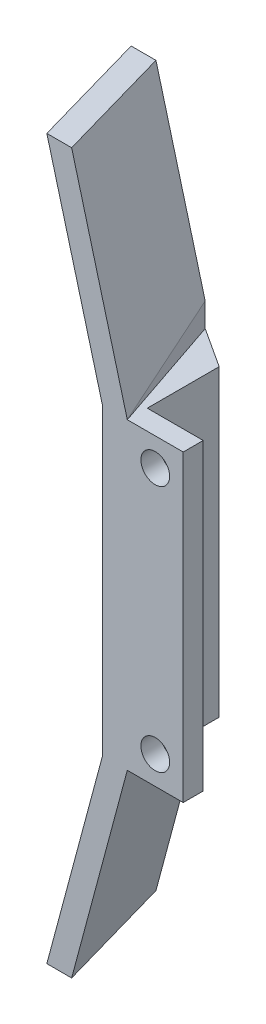
ISO-10303-21;
HEADER;
FILE_DESCRIPTION(('STEP AP214'),'2;1');
FILE_NAME('part.step','',(''),(''),'','','');
FILE_SCHEMA(('AUTOMOTIVE_DESIGN { 1 0 10303 214 1 1 1 1 }'));
ENDSEC;
DATA;
#1=APPLICATION_CONTEXT('core data for automotive mechanical design processes');
#2=APPLICATION_PROTOCOL_DEFINITION('international standard','automotive_design',2000,#1);
#3=PRODUCT_CONTEXT('',#1,'mechanical');
#4=PRODUCT('Part','Part','',(#3));
#5=PRODUCT_RELATED_PRODUCT_CATEGORY('part','',(#4));
#6=PRODUCT_DEFINITION_FORMATION('','',#4);
#7=PRODUCT_DEFINITION_CONTEXT('part definition',#1,'design');
#8=PRODUCT_DEFINITION('design','',#6,#7);
#9=PRODUCT_DEFINITION_SHAPE('','',#8);
#10=(LENGTH_UNIT() NAMED_UNIT(*) SI_UNIT(.MILLI.,.METRE.));
#11=(NAMED_UNIT(*) PLANE_ANGLE_UNIT() SI_UNIT($,.RADIAN.));
#12=(NAMED_UNIT(*) SI_UNIT($,.STERADIAN.) SOLID_ANGLE_UNIT());
#13=UNCERTAINTY_MEASURE_WITH_UNIT(LENGTH_MEASURE(1.E-05),#10,'distance_accuracy_value','');
#14=(GEOMETRIC_REPRESENTATION_CONTEXT(3) GLOBAL_UNCERTAINTY_ASSIGNED_CONTEXT((#13)) GLOBAL_UNIT_ASSIGNED_CONTEXT((#10,
#11,#12)) REPRESENTATION_CONTEXT('',''));
#15=CARTESIAN_POINT('',(0.,0.,0.));
#16=DIRECTION('',(0.,0.,1.));
#17=DIRECTION('',(1.,0.,0.));
#18=AXIS2_PLACEMENT_3D('',#15,#16,#17);
#19=CARTESIAN_POINT('',(0.,0.,0.));
#20=DIRECTION('',(0.947065879415799,0.,-0.321039281157898));
#21=DIRECTION('',(-0.321039281157898,0.,-0.947065879415799));
#22=AXIS2_PLACEMENT_3D('',#19,#20,#21);
#23=PLANE('',#22);
#24=DIRECTION('',(0.,1.,0.));
#25=VECTOR('',#24,1.);
#26=CARTESIAN_POINT('',(-5.,22.,-14.75));
#27=LINE('',#26,#25);
#28=CARTESIAN_POINT('',(-4.99999999999999,-22.,-14.75));
#29=VERTEX_POINT('',#28);
#30=CARTESIAN_POINT('',(-4.99999999999999,-19.,-14.75));
#31=VERTEX_POINT('',#30);
#32=EDGE_CURVE('E525',#29,#31,#27,.T.);
#33=ORIENTED_EDGE('',*,*,#32,.T.);
#34=DIRECTION('',(0.321039281157898,0.,0.947065879415799));
#35=VECTOR('',#34,1.);
#36=CARTESIAN_POINT('',(-51533.8701365627,-19.0000000000061,-152024.91690286));
#37=LINE('',#36,#35);
#38=CARTESIAN_POINT('',(-2.0122792321331E-13,-19.,0.));
#39=VERTEX_POINT('',#38);
#40=EDGE_CURVE('E77',#31,#39,#37,.T.);
#41=ORIENTED_EDGE('',*,*,#40,.T.);
#42=DIRECTION('',(-0.31524416249564,-0.189146497497384,-0.929970279362139));
#43=VECTOR('',#42,1.);
#44=CARTESIAN_POINT('',(0.,-19.,0.));
#45=LINE('',#44,#43);
#46=EDGE_CURVE('E498',#39,#29,#45,.T.);
#47=ORIENTED_EDGE('',*,*,#46,.T.);
#48=EDGE_LOOP('',(#33,#41,#47));
#49=FACE_BOUND('',#48,.T.);
#50=ADVANCED_FACE('F51',(#49),#23,.T.);
#51=CARTESIAN_POINT('',(0.,0.,-2.5));
#52=DIRECTION('',(0.,0.,1.));
#53=DIRECTION('',(1.,0.,0.));
#54=AXIS2_PLACEMENT_3D('',#51,#52,#53);
#55=PLANE('',#54);
#56=CARTESIAN_POINT('',(3.5,15.5,-2.5));
#57=DIRECTION('',(0.,0.,1.));
#58=DIRECTION('',(1.,0.,0.));
#59=AXIS2_PLACEMENT_3D('',#56,#57,#58);
#60=CIRCLE('',#59,1.8);
#61=CARTESIAN_POINT('',(5.3,15.5,-2.5));
#62=VERTEX_POINT('',#61);
#63=EDGE_CURVE('E195',#62,#62,#60,.F.);
#64=ORIENTED_EDGE('',*,*,#63,.F.);
#65=EDGE_LOOP('',(#64));
#66=FACE_BOUND('',#65,.T.);
#67=CARTESIAN_POINT('',(3.50000000000001,-15.5,-2.5));
#68=DIRECTION('',(0.,0.,1.));
#69=DIRECTION('',(1.,0.,0.));
#70=AXIS2_PLACEMENT_3D('',#67,#68,#69);
#71=CIRCLE('',#70,1.8);
#72=CARTESIAN_POINT('',(5.30000000000001,-15.5,-2.5));
#73=VERTEX_POINT('',#72);
#74=EDGE_CURVE('E189',#73,#73,#71,.F.);
#75=ORIENTED_EDGE('',*,*,#74,.F.);
#76=EDGE_LOOP('',(#75));
#77=FACE_BOUND('',#76,.T.);
#78=DIRECTION('',(0.,-1.,0.));
#79=VECTOR('',#78,1.);
#80=CARTESIAN_POINT('',(0.,-19.,-2.5));
#81=LINE('',#80,#79);
#82=CARTESIAN_POINT('',(0.,19.,-2.5));
#83=VERTEX_POINT('',#82);
#84=CARTESIAN_POINT('',(0.,-19.,-2.5));
#85=VERTEX_POINT('',#84);
#86=EDGE_CURVE('E169',#83,#85,#81,.T.);
#87=ORIENTED_EDGE('',*,*,#86,.F.);
#88=DIRECTION('',(-1.,0.,0.));
#89=VECTOR('',#88,1.);
#90=CARTESIAN_POINT('',(-3.10582854123025,19.,-2.5));
#91=LINE('',#90,#89);
#92=CARTESIAN_POINT('',(7.,19.,-2.5));
#93=VERTEX_POINT('',#92);
#94=EDGE_CURVE('E203',#93,#83,#91,.T.);
#95=ORIENTED_EDGE('',*,*,#94,.F.);
#96=DIRECTION('',(0.,1.,0.));
#97=VECTOR('',#96,1.);
#98=CARTESIAN_POINT('',(7.,19.,-2.5));
#99=LINE('',#98,#97);
#100=CARTESIAN_POINT('',(7.00000000000001,-19.,-2.5));
#101=VERTEX_POINT('',#100);
#102=EDGE_CURVE('E200',#101,#93,#99,.T.);
#103=ORIENTED_EDGE('',*,*,#102,.F.);
#104=DIRECTION('',(1.,0.,0.));
#105=VECTOR('',#104,1.);
#106=CARTESIAN_POINT('',(-3.10582854123025,-19.,-2.5));
#107=LINE('',#106,#105);
#108=EDGE_CURVE('E174',#85,#101,#107,.T.);
#109=ORIENTED_EDGE('',*,*,#108,.F.);
#110=EDGE_LOOP('',(#87,#95,#103,#109));
#111=FACE_BOUND('',#110,.T.);
#112=ADVANCED_FACE('F556',(#66,#77,#111),#55,.F.);
#113=CARTESIAN_POINT('',(-3.10582854123025,19.,-2.5));
#114=DIRECTION('',(0.,1.,0.));
#115=DIRECTION('',(0.,0.,1.));
#116=AXIS2_PLACEMENT_3D('',#113,#114,#115);
#117=PLANE('',#116);
#118=DIRECTION('',(-0.838443616300637,0.,-0.544988350595414));
#119=VECTOR('',#118,1.);
#120=CARTESIAN_POINT('',(0.,19.,-11.5));
#121=LINE('',#120,#119);
#122=CARTESIAN_POINT('',(0.,19.,-11.5));
#123=VERTEX_POINT('',#122);
#124=CARTESIAN_POINT('',(-5.,19.,-14.75));
#125=VERTEX_POINT('',#124);
#126=EDGE_CURVE('E156',#123,#125,#121,.T.);
#127=ORIENTED_EDGE('',*,*,#126,.T.);
#128=DIRECTION('',(-0.321039281157898,0.,-0.947065879415799));
#129=VECTOR('',#128,1.);
#130=CARTESIAN_POINT('',(-51533.8701365627,18.9999999999353,-152024.91690286));
#131=LINE('',#130,#129);
#132=CARTESIAN_POINT('',(0.,19.,0.));
#133=VERTEX_POINT('',#132);
#134=EDGE_CURVE('E69',#133,#125,#131,.T.);
#135=ORIENTED_EDGE('',*,*,#134,.F.);
#136=DIRECTION('',(-1.,0.,0.));
#137=VECTOR('',#136,1.);
#138=CARTESIAN_POINT('',(-3.10582854123025,19.,0.));
#139=LINE('',#138,#137);
#140=CARTESIAN_POINT('',(7.,19.,0.));
#141=VERTEX_POINT('',#140);
#142=EDGE_CURVE('E215',#141,#133,#139,.T.);
#143=ORIENTED_EDGE('',*,*,#142,.F.);
#144=DIRECTION('',(0.,0.,1.));
#145=VECTOR('',#144,1.);
#146=CARTESIAN_POINT('',(7.,19.,-2.5));
#147=LINE('',#146,#145);
#148=EDGE_CURVE('E12',#93,#141,#147,.T.);
#149=ORIENTED_EDGE('',*,*,#148,.F.);
#150=ORIENTED_EDGE('',*,*,#94,.T.);
#151=DIRECTION('',(0.,0.,1.));
#152=VECTOR('',#151,1.);
#153=CARTESIAN_POINT('',(0.,19.,-2.5));
#154=LINE('',#153,#152);
#155=EDGE_CURVE('E162',#123,#83,#154,.T.);
#156=ORIENTED_EDGE('',*,*,#155,.F.);
#157=EDGE_LOOP('',(#127,#135,#143,#149,#150,#156));
#158=FACE_BOUND('',#157,.T.);
#159=ADVANCED_FACE('F560',(#158),#117,.T.);
#160=CARTESIAN_POINT('',(7.,19.,-2.5));
#161=DIRECTION('',(1.,0.,0.));
#162=DIRECTION('',(0.,1.,0.));
#163=AXIS2_PLACEMENT_3D('',#160,#161,#162);
#164=PLANE('',#163);
#165=DIRECTION('',(0.,1.,0.));
#166=VECTOR('',#165,1.);
#167=CARTESIAN_POINT('',(7.,19.,0.));
#168=LINE('',#167,#166);
#169=CARTESIAN_POINT('',(7.00000000000001,-19.,0.));
#170=VERTEX_POINT('',#169);
#171=EDGE_CURVE('E213',#170,#141,#168,.T.);
#172=ORIENTED_EDGE('',*,*,#171,.F.);
#173=DIRECTION('',(0.,0.,1.));
#174=VECTOR('',#173,1.);
#175=CARTESIAN_POINT('',(7.00000000000001,-19.,-2.5));
#176=LINE('',#175,#174);
#177=EDGE_CURVE('E61',#101,#170,#176,.T.);
#178=ORIENTED_EDGE('',*,*,#177,.F.);
#179=ORIENTED_EDGE('',*,*,#102,.T.);
#180=ORIENTED_EDGE('',*,*,#148,.T.);
#181=EDGE_LOOP('',(#172,#178,#179,#180));
#182=FACE_BOUND('',#181,.T.);
#183=ADVANCED_FACE('F566',(#182),#164,.T.);
#184=CARTESIAN_POINT('',(-3.10582854123025,-19.,-2.5));
#185=DIRECTION('',(0.,-1.,0.));
#186=DIRECTION('',(0.,0.,-1.));
#187=AXIS2_PLACEMENT_3D('',#184,#185,#186);
#188=PLANE('',#187);
#189=DIRECTION('',(1.,0.,0.));
#190=VECTOR('',#189,1.);
#191=CARTESIAN_POINT('',(-3.10582854123025,-19.,0.));
#192=LINE('',#191,#190);
#193=EDGE_CURVE('E218',#39,#170,#192,.T.);
#194=ORIENTED_EDGE('',*,*,#193,.F.);
#195=ORIENTED_EDGE('',*,*,#40,.F.);
#196=DIRECTION('',(-0.838443616300637,0.,-0.544988350595414));
#197=VECTOR('',#196,1.);
#198=CARTESIAN_POINT('',(0.,-19.,-11.5));
#199=LINE('',#198,#197);
#200=CARTESIAN_POINT('',(0.,-19.,-11.5));
#201=VERTEX_POINT('',#200);
#202=EDGE_CURVE('E154',#201,#31,#199,.T.);
#203=ORIENTED_EDGE('',*,*,#202,.F.);
#204=DIRECTION('',(0.,0.,-1.));
#205=VECTOR('',#204,1.);
#206=CARTESIAN_POINT('',(0.,-19.,-2.5));
#207=LINE('',#206,#205);
#208=EDGE_CURVE('E161',#85,#201,#207,.T.);
#209=ORIENTED_EDGE('',*,*,#208,.F.);
#210=ORIENTED_EDGE('',*,*,#108,.T.);
#211=ORIENTED_EDGE('',*,*,#177,.T.);
#212=EDGE_LOOP('',(#194,#195,#203,#209,#210,#211));
#213=FACE_BOUND('',#212,.T.);
#214=ADVANCED_FACE('F53',(#213),#188,.T.);
#215=CARTESIAN_POINT('',(0.,0.,0.));
#216=DIRECTION('',(0.,0.,1.));
#217=DIRECTION('',(1.,0.,0.));
#218=AXIS2_PLACEMENT_3D('',#215,#216,#217);
#219=PLANE('',#218);
#220=DIRECTION('',(-0.258819045102521,0.965925826289068,0.));
#221=VECTOR('',#220,1.);
#222=CARTESIAN_POINT('',(-3.10582854123025,19.,0.));
#223=LINE('',#222,#221);
#224=CARTESIAN_POINT('',(-3.10582854123025,19.,0.));
#225=VERTEX_POINT('',#224);
#226=CARTESIAN_POINT('',(-10.0725075444395,45.,0.));
#227=VERTEX_POINT('',#226);
#228=EDGE_CURVE('E226',#225,#227,#223,.T.);
#229=ORIENTED_EDGE('',*,*,#228,.F.);
#230=DIRECTION('',(0.,1.,0.));
#231=VECTOR('',#230,1.);
#232=CARTESIAN_POINT('',(-3.10582854123025,0.,0.));
#233=LINE('',#232,#231);
#234=CARTESIAN_POINT('',(-3.10582854123025,-19.,0.));
#235=VERTEX_POINT('',#234);
#236=EDGE_CURVE('E197',#225,#235,#233,.F.);
#237=ORIENTED_EDGE('',*,*,#236,.T.);
#238=DIRECTION('',(0.258819045102522,0.965925826289068,0.));
#239=VECTOR('',#238,1.);
#240=CARTESIAN_POINT('',(-10.0725075444395,-45.,0.));
#241=LINE('',#240,#239);
#242=CARTESIAN_POINT('',(-10.0725075444395,-45.,0.));
#243=VERTEX_POINT('',#242);
#244=EDGE_CURVE('E181',#243,#235,#241,.T.);
#245=ORIENTED_EDGE('',*,*,#244,.F.);
#246=DIRECTION('',(-1.,0.,0.));
#247=VECTOR('',#246,1.);
#248=CARTESIAN_POINT('',(-6.96667900320921,-45.,0.));
#249=LINE('',#248,#247);
#250=CARTESIAN_POINT('',(-6.96667900320921,-45.,0.));
#251=VERTEX_POINT('',#250);
#252=EDGE_CURVE('E232',#251,#243,#249,.T.);
#253=ORIENTED_EDGE('',*,*,#252,.F.);
#254=DIRECTION('',(-0.258819045102521,-0.965925826289068,0.));
#255=VECTOR('',#254,1.);
#256=CARTESIAN_POINT('',(0.,-19.,0.));
#257=LINE('',#256,#255);
#258=EDGE_CURVE('E224',#39,#251,#257,.T.);
#259=ORIENTED_EDGE('',*,*,#258,.F.);
#260=ORIENTED_EDGE('',*,*,#193,.T.);
#261=ORIENTED_EDGE('',*,*,#171,.T.);
#262=ORIENTED_EDGE('',*,*,#142,.T.);
#263=DIRECTION('',(0.258819045102521,-0.965925826289068,0.));
#264=VECTOR('',#263,1.);
#265=CARTESIAN_POINT('',(-6.96667900320921,45.,0.));
#266=LINE('',#265,#264);
#267=CARTESIAN_POINT('',(-6.96667900320921,45.,0.));
#268=VERTEX_POINT('',#267);
#269=EDGE_CURVE('E220',#268,#133,#266,.T.);
#270=ORIENTED_EDGE('',*,*,#269,.F.);
#271=DIRECTION('',(1.,0.,0.));
#272=VECTOR('',#271,1.);
#273=CARTESIAN_POINT('',(-10.0725075444395,45.,0.));
#274=LINE('',#273,#272);
#275=EDGE_CURVE('E225',#227,#268,#274,.T.);
#276=ORIENTED_EDGE('',*,*,#275,.F.);
#277=EDGE_LOOP('',(#229,#237,#245,#253,#259,#260,#261,#262,#270,#276));
#278=FACE_BOUND('',#277,.T.);
#279=CARTESIAN_POINT('',(3.50000000000001,-15.5,0.));
#280=DIRECTION('',(0.,0.,1.));
#281=DIRECTION('',(1.,0.,0.));
#282=AXIS2_PLACEMENT_3D('',#279,#280,#281);
#283=CIRCLE('',#282,1.8);
#284=CARTESIAN_POINT('',(5.30000000000001,-15.5,0.));
#285=VERTEX_POINT('',#284);
#286=EDGE_CURVE('E186',#285,#285,#283,.T.);
#287=ORIENTED_EDGE('',*,*,#286,.F.);
#288=EDGE_LOOP('',(#287));
#289=FACE_BOUND('',#288,.T.);
#290=CARTESIAN_POINT('',(3.5,15.5,0.));
#291=DIRECTION('',(0.,0.,1.));
#292=DIRECTION('',(1.,0.,0.));
#293=AXIS2_PLACEMENT_3D('',#290,#291,#292);
#294=CIRCLE('',#293,1.8);
#295=CARTESIAN_POINT('',(5.3,15.5,0.));
#296=VERTEX_POINT('',#295);
#297=EDGE_CURVE('E192',#296,#296,#294,.T.);
#298=ORIENTED_EDGE('',*,*,#297,.F.);
#299=EDGE_LOOP('',(#298));
#300=FACE_BOUND('',#299,.T.);
#301=ADVANCED_FACE('F572',(#278,#289,#300),#219,.T.);
#302=CARTESIAN_POINT('',(3.5,15.5,-16.3730642758023));
#303=DIRECTION('',(0.,0.,1.));
#304=DIRECTION('',(1.,0.,0.));
#305=AXIS2_PLACEMENT_3D('',#302,#303,#304);
#306=CYLINDRICAL_SURFACE('',#305,1.8);
#307=ORIENTED_EDGE('',*,*,#297,.T.);
#308=EDGE_LOOP('',(#307));
#309=FACE_BOUND('',#308,.T.);
#310=ORIENTED_EDGE('',*,*,#63,.T.);
#311=EDGE_LOOP('',(#310));
#312=FACE_BOUND('',#311,.T.);
#313=ADVANCED_FACE('F571',(#309,#312),#306,.F.);
#314=CARTESIAN_POINT('',(3.50000000000001,-15.5,-16.3730642758023));
#315=DIRECTION('',(0.,0.,1.));
#316=DIRECTION('',(1.,0.,0.));
#317=AXIS2_PLACEMENT_3D('',#314,#315,#316);
#318=CYLINDRICAL_SURFACE('',#317,1.8);
#319=ORIENTED_EDGE('',*,*,#286,.T.);
#320=EDGE_LOOP('',(#319));
#321=FACE_BOUND('',#320,.T.);
#322=ORIENTED_EDGE('',*,*,#74,.T.);
#323=EDGE_LOOP('',(#322));
#324=FACE_BOUND('',#323,.T.);
#325=ADVANCED_FACE('F611',(#321,#324),#318,.F.);
#326=CARTESIAN_POINT('',(0.,0.,0.));
#327=DIRECTION('',(-1.,0.,0.));
#328=DIRECTION('',(0.,-1.,0.));
#329=AXIS2_PLACEMENT_3D('',#326,#327,#328);
#330=PLANE('',#329);
#331=ORIENTED_EDGE('',*,*,#86,.T.);
#332=ORIENTED_EDGE('',*,*,#208,.T.);
#333=DIRECTION('',(0.,1.,0.));
#334=VECTOR('',#333,1.);
#335=CARTESIAN_POINT('',(0.,-19.,-11.5));
#336=LINE('',#335,#334);
#337=EDGE_CURVE('E150',#201,#123,#336,.T.);
#338=ORIENTED_EDGE('',*,*,#337,.T.);
#339=ORIENTED_EDGE('',*,*,#155,.T.);
#340=EDGE_LOOP('',(#331,#332,#338,#339));
#341=FACE_BOUND('',#340,.T.);
#342=ADVANCED_FACE('F168',(#341),#330,.F.);
#343=CARTESIAN_POINT('',(0.,0.,-14.75));
#344=DIRECTION('',(0.,0.,-1.));
#345=DIRECTION('',(-1.,0.,0.));
#346=AXIS2_PLACEMENT_3D('',#343,#344,#345);
#347=PLANE('',#346);
#348=CARTESIAN_POINT('',(-5.,22.,-14.75));
#349=VERTEX_POINT('',#348);
#350=EDGE_CURVE('E55',#125,#349,#27,.T.);
#351=ORIENTED_EDGE('',*,*,#350,.F.);
#352=EDGE_CURVE('E326',#31,#125,#27,.T.);
#353=ORIENTED_EDGE('',*,*,#352,.F.);
#354=ORIENTED_EDGE('',*,*,#32,.F.);
#355=DIRECTION('',(0.258819045102514,0.96592582628907,0.));
#356=VECTOR('',#355,1.);
#357=CARTESIAN_POINT('',(-11.1628314259157,-45.,-14.75));
#358=LINE('',#357,#356);
#359=CARTESIAN_POINT('',(-11.1628314259157,-45.,-14.75));
#360=VERTEX_POINT('',#359);
#361=EDGE_CURVE('E522',#360,#29,#358,.T.);
#362=ORIENTED_EDGE('',*,*,#361,.F.);
#363=DIRECTION('',(1.,0.,0.));
#364=VECTOR('',#363,1.);
#365=CARTESIAN_POINT('',(-11.1628314259157,-45.,-14.75));
#366=LINE('',#365,#364);
#367=CARTESIAN_POINT('',(-14.2686599671459,-45.,-14.75));
#368=VERTEX_POINT('',#367);
#369=EDGE_CURVE('E524',#368,#360,#366,.T.);
#370=ORIENTED_EDGE('',*,*,#369,.F.);
#371=DIRECTION('',(-0.258819045102514,-0.96592582628907,0.));
#372=VECTOR('',#371,1.);
#373=CARTESIAN_POINT('',(-14.2686599671459,-45.,-14.75));
#374=LINE('',#373,#372);
#375=CARTESIAN_POINT('',(-8.10582854123024,-22.,-14.75));
#376=VERTEX_POINT('',#375);
#377=EDGE_CURVE('E427',#376,#368,#374,.T.);
#378=ORIENTED_EDGE('',*,*,#377,.F.);
#379=DIRECTION('',(0.,-1.,0.));
#380=VECTOR('',#379,1.);
#381=CARTESIAN_POINT('',(-8.10582854123025,22.,-14.75));
#382=LINE('',#381,#380);
#383=CARTESIAN_POINT('',(-8.10582854123025,22.,-14.75));
#384=VERTEX_POINT('',#383);
#385=EDGE_CURVE('E441',#384,#376,#382,.T.);
#386=ORIENTED_EDGE('',*,*,#385,.F.);
#387=DIRECTION('',(0.258819045102521,-0.965925826289068,0.));
#388=VECTOR('',#387,1.);
#389=CARTESIAN_POINT('',(-14.2686599671461,45.,-14.75));
#390=LINE('',#389,#388);
#391=CARTESIAN_POINT('',(-14.2686599671461,45.,-14.75));
#392=VERTEX_POINT('',#391);
#393=EDGE_CURVE('E250',#392,#384,#390,.T.);
#394=ORIENTED_EDGE('',*,*,#393,.F.);
#395=DIRECTION('',(-1.,0.,0.));
#396=VECTOR('',#395,1.);
#397=CARTESIAN_POINT('',(-11.1628314259158,45.,-14.75));
#398=LINE('',#397,#396);
#399=CARTESIAN_POINT('',(-11.1628314259158,45.,-14.75));
#400=VERTEX_POINT('',#399);
#401=EDGE_CURVE('E245',#400,#392,#398,.T.);
#402=ORIENTED_EDGE('',*,*,#401,.F.);
#403=DIRECTION('',(-0.258819045102522,0.965925826289068,0.));
#404=VECTOR('',#403,1.);
#405=CARTESIAN_POINT('',(-11.1628314259158,45.,-14.75));
#406=LINE('',#405,#404);
#407=EDGE_CURVE('E377',#349,#400,#406,.T.);
#408=ORIENTED_EDGE('',*,*,#407,.F.);
#409=EDGE_LOOP('',(#351,#353,#354,#362,#370,#378,#386,#394,#402,#408));
#410=FACE_BOUND('',#409,.T.);
#411=ADVANCED_FACE('F262',(#410),#347,.T.);
#412=CARTESIAN_POINT('',(1.72218022635435,-0.461456800872483,-0.489934286722323));
#413=DIRECTION('',(-0.93140056510896,0.249568029250831,0.26496940595202));
#414=DIRECTION('',(0.27362773499771,0.,0.961835673407897));
#415=AXIS2_PLACEMENT_3D('',#412,#413,#414);
#416=PLANE('',#415);
#417=DIRECTION('',(-0.31524416249564,-0.189146497497386,-0.929970279362139));
#418=VECTOR('',#417,1.);
#419=CARTESIAN_POINT('',(-3.10582854123025,-19.,0.));
#420=LINE('',#419,#418);
#421=EDGE_CURVE('E538',#235,#376,#420,.T.);
#422=ORIENTED_EDGE('',*,*,#421,.T.);
#423=ORIENTED_EDGE('',*,*,#377,.T.);
#424=DIRECTION('',(-0.273627734997698,0.,-0.9618356734079));
#425=VECTOR('',#424,1.);
#426=CARTESIAN_POINT('',(-10.0725075444395,-45.,0.));
#427=LINE('',#426,#425);
#428=EDGE_CURVE('E536',#243,#368,#427,.T.);
#429=ORIENTED_EDGE('',*,*,#428,.F.);
#430=ORIENTED_EDGE('',*,*,#244,.T.);
#431=EDGE_LOOP('',(#422,#423,#429,#430));
#432=FACE_BOUND('',#431,.T.);
#433=ADVANCED_FACE('F272',(#432),#416,.T.);
#434=CARTESIAN_POINT('',(1.00536852414957E-13,-45.,0.));
#435=DIRECTION('',(0.,-1.,0.));
#436=DIRECTION('',(1.,0.,0.));
#437=AXIS2_PLACEMENT_3D('',#434,#435,#436);
#438=PLANE('',#437);
#439=ORIENTED_EDGE('',*,*,#428,.T.);
#440=ORIENTED_EDGE('',*,*,#369,.T.);
#441=DIRECTION('',(-0.273627734997699,0.,-0.9618356734079));
#442=VECTOR('',#441,1.);
#443=CARTESIAN_POINT('',(-6.96667900320921,-45.,0.));
#444=LINE('',#443,#442);
#445=EDGE_CURVE('E249',#251,#360,#444,.T.);
#446=ORIENTED_EDGE('',*,*,#445,.F.);
#447=ORIENTED_EDGE('',*,*,#252,.T.);
#448=EDGE_LOOP('',(#439,#440,#446,#447));
#449=FACE_BOUND('',#448,.T.);
#450=ADVANCED_FACE('F396',(#449),#438,.T.);
#451=CARTESIAN_POINT('',(-2.78572253337348,0.,0.944312723177451));
#452=DIRECTION('',(-0.947065879415799,0.,0.321039281157898));
#453=DIRECTION('',(0.321039281157898,0.,0.947065879415799));
#454=AXIS2_PLACEMENT_3D('',#451,#452,#453);
#455=PLANE('',#454);
#456=ORIENTED_EDGE('',*,*,#385,.T.);
#457=ORIENTED_EDGE('',*,*,#421,.F.);
#458=ORIENTED_EDGE('',*,*,#236,.F.);
#459=DIRECTION('',(-0.31524416249564,0.189146497497383,-0.929970279362139));
#460=VECTOR('',#459,1.);
#461=CARTESIAN_POINT('',(-3.10582854123025,19.,0.));
#462=LINE('',#461,#460);
#463=EDGE_CURVE('E480',#225,#384,#462,.T.);
#464=ORIENTED_EDGE('',*,*,#463,.T.);
#465=EDGE_LOOP('',(#456,#457,#458,#464));
#466=FACE_BOUND('',#465,.T.);
#467=ADVANCED_FACE('F406',(#466),#455,.T.);
#468=CARTESIAN_POINT('',(1.72218022635447,0.461456800872529,-0.489934286722357));
#469=DIRECTION('',(-0.931400565108958,-0.249568029250837,0.26496940595202));
#470=DIRECTION('',(0.27362773499771,0.,0.961835673407897));
#471=AXIS2_PLACEMENT_3D('',#468,#469,#470);
#472=PLANE('',#471);
#473=DIRECTION('',(-0.273627734997709,0.,-0.961835673407898));
#474=VECTOR('',#473,1.);
#475=CARTESIAN_POINT('',(-10.0725075444395,45.,0.));
#476=LINE('',#475,#474);
#477=EDGE_CURVE('E473',#227,#392,#476,.T.);
#478=ORIENTED_EDGE('',*,*,#477,.T.);
#479=ORIENTED_EDGE('',*,*,#393,.T.);
#480=ORIENTED_EDGE('',*,*,#463,.F.);
#481=ORIENTED_EDGE('',*,*,#228,.T.);
#482=EDGE_LOOP('',(#478,#479,#480,#481));
#483=FACE_BOUND('',#482,.T.);
#484=ADVANCED_FACE('F457',(#483),#472,.T.);
#485=CARTESIAN_POINT('',(-1.00536852414957E-13,45.,0.));
#486=DIRECTION('',(0.,1.,0.));
#487=DIRECTION('',(-1.,0.,0.));
#488=AXIS2_PLACEMENT_3D('',#485,#486,#487);
#489=PLANE('',#488);
#490=DIRECTION('',(-0.27362773499771,0.,-0.961835673407897));
#491=VECTOR('',#490,1.);
#492=CARTESIAN_POINT('',(-6.96667900320921,45.,0.));
#493=LINE('',#492,#491);
#494=EDGE_CURVE('E481',#268,#400,#493,.T.);
#495=ORIENTED_EDGE('',*,*,#494,.T.);
#496=ORIENTED_EDGE('',*,*,#401,.T.);
#497=ORIENTED_EDGE('',*,*,#477,.F.);
#498=ORIENTED_EDGE('',*,*,#275,.T.);
#499=EDGE_LOOP('',(#495,#496,#497,#498));
#500=FACE_BOUND('',#499,.T.);
#501=ADVANCED_FACE('F356',(#500),#489,.T.);
#502=CARTESIAN_POINT('',(4.41650826606983,1.18339982325879,-1.256429956649));
#503=DIRECTION('',(0.931400565108958,0.249568029250838,-0.264969405952019));
#504=DIRECTION('',(-0.273627734997709,0.,-0.961835673407897));
#505=AXIS2_PLACEMENT_3D('',#502,#503,#504);
#506=PLANE('',#505);
#507=DIRECTION('',(-0.31524416249564,0.189146497497384,-0.929970279362139));
#508=VECTOR('',#507,1.);
#509=CARTESIAN_POINT('',(0.,19.,0.));
#510=LINE('',#509,#508);
#511=EDGE_CURVE('E494',#133,#349,#510,.T.);
#512=ORIENTED_EDGE('',*,*,#511,.T.);
#513=ORIENTED_EDGE('',*,*,#407,.T.);
#514=ORIENTED_EDGE('',*,*,#494,.F.);
#515=ORIENTED_EDGE('',*,*,#269,.T.);
#516=EDGE_LOOP('',(#512,#513,#514,#515));
#517=FACE_BOUND('',#516,.T.);
#518=ADVANCED_FACE('F352',(#517),#506,.T.);
#519=ORIENTED_EDGE('',*,*,#134,.T.);
#520=ORIENTED_EDGE('',*,*,#350,.T.);
#521=ORIENTED_EDGE('',*,*,#511,.F.);
#522=EDGE_LOOP('',(#519,#520,#521));
#523=FACE_BOUND('',#522,.T.);
#524=ADVANCED_FACE('F343',(#523),#23,.T.);
#525=CARTESIAN_POINT('',(4.41650826606956,-1.18339982325869,-1.25642995664887));
#526=DIRECTION('',(0.931400565108963,-0.249568029250831,-0.264969405952009));
#527=DIRECTION('',(-0.273627734997698,0.,-0.961835673407901));
#528=AXIS2_PLACEMENT_3D('',#525,#526,#527);
#529=PLANE('',#528);
#530=ORIENTED_EDGE('',*,*,#445,.T.);
#531=ORIENTED_EDGE('',*,*,#361,.T.);
#532=ORIENTED_EDGE('',*,*,#46,.F.);
#533=ORIENTED_EDGE('',*,*,#258,.T.);
#534=EDGE_LOOP('',(#530,#531,#532,#533));
#535=FACE_BOUND('',#534,.T.);
#536=ADVANCED_FACE('F273',(#535),#529,.T.);
#537=CARTESIAN_POINT('',(0.,0.,-11.5));
#538=DIRECTION('',(0.544988350595414,0.,-0.838443616300637));
#539=DIRECTION('',(-0.838443616300637,0.,-0.544988350595414));
#540=AXIS2_PLACEMENT_3D('',#537,#538,#539);
#541=PLANE('',#540);
#542=ORIENTED_EDGE('',*,*,#126,.F.);
#543=ORIENTED_EDGE('',*,*,#337,.F.);
#544=ORIENTED_EDGE('',*,*,#202,.T.);
#545=ORIENTED_EDGE('',*,*,#352,.T.);
#546=EDGE_LOOP('',(#542,#543,#544,#545));
#547=FACE_BOUND('',#546,.T.);
#548=ADVANCED_FACE('F152',(#547),#541,.T.);
#549=CLOSED_SHELL('',(#50,#112,#159,#183,#214,#301,#313,#325,#342,#411,#433,#450,#467,#484,#501,
#518,#524,#536,#548));
#550=MANIFOLD_SOLID_BREP('B2',#549);
#551=ADVANCED_BREP_SHAPE_REPRESENTATION('',(#18,#550),#14);
#552=SHAPE_DEFINITION_REPRESENTATION(#9,#551);
ENDSEC;
END-ISO-10303-21;
